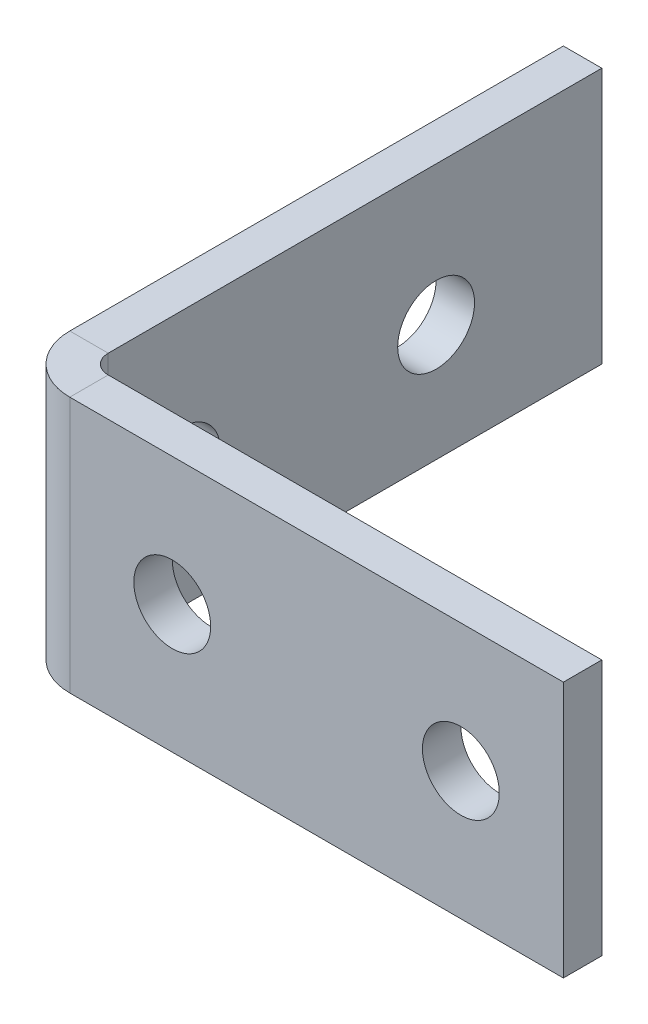
ISO-10303-21;
HEADER;
FILE_DESCRIPTION(('STEP AP214'),'2;1');
FILE_NAME('part.step','',(''),(''),'','','');
FILE_SCHEMA(('AUTOMOTIVE_DESIGN { 1 0 10303 214 1 1 1 1 }'));
ENDSEC;
DATA;
#1=APPLICATION_CONTEXT('core data for automotive mechanical design processes');
#2=APPLICATION_PROTOCOL_DEFINITION('international standard','automotive_design',2000,#1);
#3=PRODUCT_CONTEXT('',#1,'mechanical');
#4=PRODUCT('Part','Part','',(#3));
#5=PRODUCT_RELATED_PRODUCT_CATEGORY('part','',(#4));
#6=PRODUCT_DEFINITION_FORMATION('','',#4);
#7=PRODUCT_DEFINITION_CONTEXT('part definition',#1,'design');
#8=PRODUCT_DEFINITION('design','',#6,#7);
#9=PRODUCT_DEFINITION_SHAPE('','',#8);
#10=(LENGTH_UNIT() NAMED_UNIT(*) SI_UNIT(.MILLI.,.METRE.));
#11=(NAMED_UNIT(*) PLANE_ANGLE_UNIT() SI_UNIT($,.RADIAN.));
#12=(NAMED_UNIT(*) SI_UNIT($,.STERADIAN.) SOLID_ANGLE_UNIT());
#13=UNCERTAINTY_MEASURE_WITH_UNIT(LENGTH_MEASURE(1.E-05),#10,'distance_accuracy_value','');
#14=(GEOMETRIC_REPRESENTATION_CONTEXT(3) GLOBAL_UNCERTAINTY_ASSIGNED_CONTEXT((#13)) GLOBAL_UNIT_ASSIGNED_CONTEXT((#10,
#11,#12)) REPRESENTATION_CONTEXT('',''));
#15=CARTESIAN_POINT('',(0.,0.,0.));
#16=DIRECTION('',(0.,0.,1.));
#17=DIRECTION('',(1.,0.,0.));
#18=AXIS2_PLACEMENT_3D('',#15,#16,#17);
#19=CARTESIAN_POINT('',(-1.5,10.,0.));
#20=DIRECTION('',(1.,0.,0.));
#21=DIRECTION('',(0.,0.,-1.));
#22=AXIS2_PLACEMENT_3D('',#19,#20,#21);
#23=PLANE('',#22);
#24=CARTESIAN_POINT('',(-1.5,4.56076284628182,16.3870233657253));
#25=DIRECTION('',(-1.,0.,0.));
#26=DIRECTION('',(0.,0.,1.));
#27=AXIS2_PLACEMENT_3D('',#24,#25,#26);
#28=CIRCLE('',#27,1.49999999999999);
#29=CARTESIAN_POINT('',(-1.5,4.56076284628182,17.8870233657253));
#30=VERTEX_POINT('',#29);
#31=EDGE_CURVE('E258',#30,#30,#28,.T.);
#32=ORIENTED_EDGE('',*,*,#31,.F.);
#33=EDGE_LOOP('',(#32));
#34=FACE_BOUND('',#33,.T.);
#35=DIRECTION('',(0.,0.,1.));
#36=VECTOR('',#35,1.);
#37=CARTESIAN_POINT('',(-1.5,0.,0.));
#38=LINE('',#37,#36);
#39=CARTESIAN_POINT('',(-1.5,0.,0.));
#40=VERTEX_POINT('',#39);
#41=CARTESIAN_POINT('',(-1.5,0.,19.2634));
#42=VERTEX_POINT('',#41);
#43=EDGE_CURVE('E155',#40,#42,#38,.T.);
#44=ORIENTED_EDGE('',*,*,#43,.T.);
#45=DIRECTION('',(0.,-1.,0.));
#46=VECTOR('',#45,1.);
#47=CARTESIAN_POINT('',(-1.5,10.,19.2634));
#48=LINE('',#47,#46);
#49=CARTESIAN_POINT('',(-1.5,10.,19.2634));
#50=VERTEX_POINT('',#49);
#51=EDGE_CURVE('E118',#50,#42,#48,.T.);
#52=ORIENTED_EDGE('',*,*,#51,.F.);
#53=DIRECTION('',(0.,0.,1.));
#54=VECTOR('',#53,1.);
#55=CARTESIAN_POINT('',(-1.5,10.,0.));
#56=LINE('',#55,#54);
#57=CARTESIAN_POINT('',(-1.5,10.,0.));
#58=VERTEX_POINT('',#57);
#59=EDGE_CURVE('E122',#58,#50,#56,.T.);
#60=ORIENTED_EDGE('',*,*,#59,.F.);
#61=DIRECTION('',(0.,-1.,0.));
#62=VECTOR('',#61,1.);
#63=CARTESIAN_POINT('',(-1.5,10.,0.));
#64=LINE('',#63,#62);
#65=EDGE_CURVE('E109',#58,#40,#64,.T.);
#66=ORIENTED_EDGE('',*,*,#65,.T.);
#67=EDGE_LOOP('',(#44,#52,#60,#66));
#68=FACE_BOUND('',#67,.T.);
#69=CARTESIAN_POINT('',(-1.5,4.56076284628182,6.46670351632039));
#70=DIRECTION('',(-1.,0.,0.));
#71=DIRECTION('',(0.,0.,1.));
#72=AXIS2_PLACEMENT_3D('',#69,#70,#71);
#73=CIRCLE('',#72,1.49999999999999);
#74=CARTESIAN_POINT('',(-1.5,4.56076284628182,7.96670351632038));
#75=VERTEX_POINT('',#74);
#76=EDGE_CURVE('E252',#75,#75,#73,.T.);
#77=ORIENTED_EDGE('',*,*,#76,.F.);
#78=EDGE_LOOP('',(#77));
#79=FACE_BOUND('',#78,.T.);
#80=ADVANCED_FACE('F36',(#34,#68,#79),#23,.F.);
#81=CARTESIAN_POINT('',(0.736600000000002,10.,20.));
#82=DIRECTION('',(0.,1.,0.));
#83=DIRECTION('',(0.,0.,1.));
#84=AXIS2_PLACEMENT_3D('',#81,#82,#83);
#85=PLANE('',#84);
#86=DIRECTION('',(0.,0.,1.));
#87=VECTOR('',#86,1.);
#88=CARTESIAN_POINT('',(0.736600000000002,10.,20.));
#89=LINE('',#88,#87);
#90=CARTESIAN_POINT('',(0.736600000000002,10.,20.));
#91=VERTEX_POINT('',#90);
#92=CARTESIAN_POINT('',(0.736600000000002,10.,21.5));
#93=VERTEX_POINT('',#92);
#94=EDGE_CURVE('E11',#91,#93,#89,.T.);
#95=ORIENTED_EDGE('',*,*,#94,.F.);
#96=CARTESIAN_POINT('',(0.736600000000002,10.,19.2634));
#97=DIRECTION('',(0.,-1.,0.));
#98=DIRECTION('',(0.,0.,-1.));
#99=AXIS2_PLACEMENT_3D('',#96,#97,#98);
#100=CIRCLE('',#99,0.7366);
#101=CARTESIAN_POINT('',(0.,10.,19.2634));
#102=VERTEX_POINT('',#101);
#103=EDGE_CURVE('E134',#102,#91,#100,.F.);
#104=ORIENTED_EDGE('',*,*,#103,.F.);
#105=DIRECTION('',(1.,0.,0.));
#106=VECTOR('',#105,1.);
#107=CARTESIAN_POINT('',(-1.5,10.,19.2634));
#108=LINE('',#107,#106);
#109=EDGE_CURVE('E45',#50,#102,#108,.T.);
#110=ORIENTED_EDGE('',*,*,#109,.F.);
#111=CARTESIAN_POINT('',(0.736600000000002,10.,19.2634));
#112=DIRECTION('',(0.,1.,0.));
#113=DIRECTION('',(1.,0.,0.));
#114=AXIS2_PLACEMENT_3D('',#111,#112,#113);
#115=CIRCLE('',#114,2.2366);
#116=EDGE_CURVE('E127',#50,#93,#115,.T.);
#117=ORIENTED_EDGE('',*,*,#116,.T.);
#118=EDGE_LOOP('',(#95,#104,#110,#117));
#119=FACE_BOUND('',#118,.T.);
#120=ADVANCED_FACE('F38',(#119),#85,.T.);
#121=CARTESIAN_POINT('',(-1.5,10.,19.2634));
#122=DIRECTION('',(0.,1.,0.));
#123=DIRECTION('',(0.,0.,1.));
#124=AXIS2_PLACEMENT_3D('',#121,#122,#123);
#125=PLANE('',#124);
#126=DIRECTION('',(1.,0.,0.));
#127=VECTOR('',#126,1.);
#128=CARTESIAN_POINT('',(0.,10.,20.));
#129=LINE('',#128,#127);
#130=CARTESIAN_POINT('',(20.,10.,20.));
#131=VERTEX_POINT('',#130);
#132=EDGE_CURVE('E184',#91,#131,#129,.T.);
#133=ORIENTED_EDGE('',*,*,#132,.F.);
#134=ORIENTED_EDGE('',*,*,#94,.T.);
#135=DIRECTION('',(1.,0.,0.));
#136=VECTOR('',#135,1.);
#137=CARTESIAN_POINT('',(0.,10.,21.5));
#138=LINE('',#137,#136);
#139=CARTESIAN_POINT('',(20.,10.,21.5));
#140=VERTEX_POINT('',#139);
#141=EDGE_CURVE('E93',#93,#140,#138,.T.);
#142=ORIENTED_EDGE('',*,*,#141,.T.);
#143=DIRECTION('',(0.,0.,1.));
#144=VECTOR('',#143,1.);
#145=CARTESIAN_POINT('',(20.,10.,20.));
#146=LINE('',#145,#144);
#147=EDGE_CURVE('E244',#131,#140,#146,.T.);
#148=ORIENTED_EDGE('',*,*,#147,.F.);
#149=EDGE_LOOP('',(#133,#134,#142,#148));
#150=FACE_BOUND('',#149,.T.);
#151=ADVANCED_FACE('F192',(#150),#125,.T.);
#152=CARTESIAN_POINT('',(0.,0.,19.2634));
#153=DIRECTION('',(0.,-1.,0.));
#154=DIRECTION('',(0.,0.,-1.));
#155=AXIS2_PLACEMENT_3D('',#152,#153,#154);
#156=PLANE('',#155);
#157=DIRECTION('',(-1.,0.,0.));
#158=VECTOR('',#157,1.);
#159=CARTESIAN_POINT('',(0.,0.,19.2634));
#160=LINE('',#159,#158);
#161=CARTESIAN_POINT('',(0.,0.,19.2634));
#162=VERTEX_POINT('',#161);
#163=EDGE_CURVE('E80',#162,#42,#160,.T.);
#164=ORIENTED_EDGE('',*,*,#163,.F.);
#165=CARTESIAN_POINT('',(0.736600000000002,0.,19.2634));
#166=DIRECTION('',(0.,-1.,0.));
#167=DIRECTION('',(0.,0.,-1.));
#168=AXIS2_PLACEMENT_3D('',#165,#166,#167);
#169=CIRCLE('',#168,0.7366);
#170=CARTESIAN_POINT('',(0.736600000000002,0.,20.));
#171=VERTEX_POINT('',#170);
#172=EDGE_CURVE('E150',#162,#171,#169,.F.);
#173=ORIENTED_EDGE('',*,*,#172,.T.);
#174=DIRECTION('',(0.,0.,-1.));
#175=VECTOR('',#174,1.);
#176=CARTESIAN_POINT('',(0.736600000000002,0.,21.5));
#177=LINE('',#176,#175);
#178=CARTESIAN_POINT('',(0.736600000000002,0.,21.5));
#179=VERTEX_POINT('',#178);
#180=EDGE_CURVE('E87',#179,#171,#177,.T.);
#181=ORIENTED_EDGE('',*,*,#180,.F.);
#182=CARTESIAN_POINT('',(0.736600000000002,0.,19.2634));
#183=DIRECTION('',(0.,1.,0.));
#184=DIRECTION('',(1.,0.,0.));
#185=AXIS2_PLACEMENT_3D('',#182,#183,#184);
#186=CIRCLE('',#185,2.2366);
#187=EDGE_CURVE('E157',#42,#179,#186,.T.);
#188=ORIENTED_EDGE('',*,*,#187,.F.);
#189=EDGE_LOOP('',(#164,#173,#181,#188));
#190=FACE_BOUND('',#189,.T.);
#191=ADVANCED_FACE('F190',(#190),#156,.T.);
#192=CARTESIAN_POINT('',(0.736600000000002,0.,21.5));
#193=DIRECTION('',(0.,-1.,0.));
#194=DIRECTION('',(0.,0.,-1.));
#195=AXIS2_PLACEMENT_3D('',#192,#193,#194);
#196=PLANE('',#195);
#197=DIRECTION('',(0.,0.,1.));
#198=VECTOR('',#197,1.);
#199=CARTESIAN_POINT('',(0.,0.,0.));
#200=LINE('',#199,#198);
#201=CARTESIAN_POINT('',(0.,0.,0.));
#202=VERTEX_POINT('',#201);
#203=EDGE_CURVE('E152',#202,#162,#200,.T.);
#204=ORIENTED_EDGE('',*,*,#203,.T.);
#205=ORIENTED_EDGE('',*,*,#163,.T.);
#206=ORIENTED_EDGE('',*,*,#43,.F.);
#207=DIRECTION('',(1.,0.,0.));
#208=VECTOR('',#207,1.);
#209=CARTESIAN_POINT('',(-1.5,0.,0.));
#210=LINE('',#209,#208);
#211=EDGE_CURVE('E115',#40,#202,#210,.T.);
#212=ORIENTED_EDGE('',*,*,#211,.T.);
#213=EDGE_LOOP('',(#204,#205,#206,#212));
#214=FACE_BOUND('',#213,.T.);
#215=ADVANCED_FACE('F186',(#214),#196,.T.);
#216=CARTESIAN_POINT('',(0.,10.,21.5));
#217=DIRECTION('',(0.,0.,-1.));
#218=DIRECTION('',(-1.,0.,0.));
#219=AXIS2_PLACEMENT_3D('',#216,#217,#218);
#220=PLANE('',#219);
#221=CARTESIAN_POINT('',(4.7366,5.,21.5));
#222=DIRECTION('',(0.,0.,-1.));
#223=DIRECTION('',(-1.,0.,0.));
#224=AXIS2_PLACEMENT_3D('',#221,#222,#223);
#225=CIRCLE('',#224,1.5);
#226=CARTESIAN_POINT('',(3.2366,5.,21.5));
#227=VERTEX_POINT('',#226);
#228=EDGE_CURVE('E233',#227,#227,#225,.T.);
#229=ORIENTED_EDGE('',*,*,#228,.T.);
#230=EDGE_LOOP('',(#229));
#231=FACE_BOUND('',#230,.T.);
#232=CARTESIAN_POINT('',(16.,5.,21.5));
#233=DIRECTION('',(0.,0.,-1.));
#234=DIRECTION('',(-1.,0.,0.));
#235=AXIS2_PLACEMENT_3D('',#232,#233,#234);
#236=CIRCLE('',#235,1.5);
#237=CARTESIAN_POINT('',(14.5,5.,21.5));
#238=VERTEX_POINT('',#237);
#239=EDGE_CURVE('E237',#238,#238,#236,.T.);
#240=ORIENTED_EDGE('',*,*,#239,.T.);
#241=EDGE_LOOP('',(#240));
#242=FACE_BOUND('',#241,.T.);
#243=DIRECTION('',(1.,0.,0.));
#244=VECTOR('',#243,1.);
#245=CARTESIAN_POINT('',(0.,0.,21.5));
#246=LINE('',#245,#244);
#247=CARTESIAN_POINT('',(20.,0.,21.5));
#248=VERTEX_POINT('',#247);
#249=EDGE_CURVE('E140',#179,#248,#246,.T.);
#250=ORIENTED_EDGE('',*,*,#249,.T.);
#251=DIRECTION('',(0.,-1.,0.));
#252=VECTOR('',#251,1.);
#253=CARTESIAN_POINT('',(20.,10.,21.5));
#254=LINE('',#253,#252);
#255=EDGE_CURVE('E171',#140,#248,#254,.T.);
#256=ORIENTED_EDGE('',*,*,#255,.F.);
#257=ORIENTED_EDGE('',*,*,#141,.F.);
#258=DIRECTION('',(0.,-1.,0.));
#259=VECTOR('',#258,1.);
#260=CARTESIAN_POINT('',(0.736600000000002,10.,21.5));
#261=LINE('',#260,#259);
#262=EDGE_CURVE('E139',#93,#179,#261,.T.);
#263=ORIENTED_EDGE('',*,*,#262,.T.);
#264=EDGE_LOOP('',(#250,#256,#257,#263));
#265=FACE_BOUND('',#264,.T.);
#266=ADVANCED_FACE('F198',(#231,#242,#265),#220,.F.);
#267=CARTESIAN_POINT('',(20.,10.,20.));
#268=DIRECTION('',(1.,0.,0.));
#269=DIRECTION('',(0.,0.,-1.));
#270=AXIS2_PLACEMENT_3D('',#267,#268,#269);
#271=PLANE('',#270);
#272=DIRECTION('',(0.,0.,1.));
#273=VECTOR('',#272,1.);
#274=CARTESIAN_POINT('',(20.,0.,20.));
#275=LINE('',#274,#273);
#276=CARTESIAN_POINT('',(20.,0.,20.));
#277=VERTEX_POINT('',#276);
#278=EDGE_CURVE('E143',#277,#248,#275,.T.);
#279=ORIENTED_EDGE('',*,*,#278,.F.);
#280=DIRECTION('',(0.,-1.,0.));
#281=VECTOR('',#280,1.);
#282=CARTESIAN_POINT('',(20.,10.,20.));
#283=LINE('',#282,#281);
#284=EDGE_CURVE('E169',#131,#277,#283,.T.);
#285=ORIENTED_EDGE('',*,*,#284,.F.);
#286=ORIENTED_EDGE('',*,*,#147,.T.);
#287=ORIENTED_EDGE('',*,*,#255,.T.);
#288=EDGE_LOOP('',(#279,#285,#286,#287));
#289=FACE_BOUND('',#288,.T.);
#290=ADVANCED_FACE('F220',(#289),#271,.T.);
#291=CARTESIAN_POINT('',(0.,10.,20.));
#292=DIRECTION('',(0.,0.,-1.));
#293=DIRECTION('',(-1.,0.,0.));
#294=AXIS2_PLACEMENT_3D('',#291,#292,#293);
#295=PLANE('',#294);
#296=CARTESIAN_POINT('',(4.7366,5.,20.));
#297=DIRECTION('',(0.,0.,-1.));
#298=DIRECTION('',(-1.,0.,0.));
#299=AXIS2_PLACEMENT_3D('',#296,#297,#298);
#300=CIRCLE('',#299,1.49999999999999);
#301=CARTESIAN_POINT('',(3.23660000000001,5.,20.));
#302=VERTEX_POINT('',#301);
#303=EDGE_CURVE('E266',#302,#302,#300,.T.);
#304=ORIENTED_EDGE('',*,*,#303,.F.);
#305=EDGE_LOOP('',(#304));
#306=FACE_BOUND('',#305,.T.);
#307=CARTESIAN_POINT('',(16.,5.,20.));
#308=DIRECTION('',(0.,0.,-1.));
#309=DIRECTION('',(-1.,0.,0.));
#310=AXIS2_PLACEMENT_3D('',#307,#308,#309);
#311=CIRCLE('',#310,1.49999999999999);
#312=CARTESIAN_POINT('',(14.5,5.,20.));
#313=VERTEX_POINT('',#312);
#314=EDGE_CURVE('E262',#313,#313,#311,.T.);
#315=ORIENTED_EDGE('',*,*,#314,.F.);
#316=EDGE_LOOP('',(#315));
#317=FACE_BOUND('',#316,.T.);
#318=DIRECTION('',(1.,0.,0.));
#319=VECTOR('',#318,1.);
#320=CARTESIAN_POINT('',(0.,0.,20.));
#321=LINE('',#320,#319);
#322=EDGE_CURVE('E147',#171,#277,#321,.T.);
#323=ORIENTED_EDGE('',*,*,#322,.F.);
#324=DIRECTION('',(0.,-1.,0.));
#325=VECTOR('',#324,1.);
#326=CARTESIAN_POINT('',(0.736600000000002,10.,20.));
#327=LINE('',#326,#325);
#328=EDGE_CURVE('E166',#91,#171,#327,.T.);
#329=ORIENTED_EDGE('',*,*,#328,.F.);
#330=ORIENTED_EDGE('',*,*,#132,.T.);
#331=ORIENTED_EDGE('',*,*,#284,.T.);
#332=EDGE_LOOP('',(#323,#329,#330,#331));
#333=FACE_BOUND('',#332,.T.);
#334=ADVANCED_FACE('F217',(#306,#317,#333),#295,.T.);
#335=CARTESIAN_POINT('',(0.736600000000002,10.,19.2634));
#336=DIRECTION('',(0.,-1.,0.));
#337=DIRECTION('',(0.,0.,-1.));
#338=AXIS2_PLACEMENT_3D('',#335,#336,#337);
#339=CYLINDRICAL_SURFACE('',#338,0.7366);
#340=ORIENTED_EDGE('',*,*,#172,.F.);
#341=DIRECTION('',(0.,-1.,0.));
#342=VECTOR('',#341,1.);
#343=CARTESIAN_POINT('',(0.,10.,19.2634));
#344=LINE('',#343,#342);
#345=EDGE_CURVE('E163',#102,#162,#344,.T.);
#346=ORIENTED_EDGE('',*,*,#345,.F.);
#347=ORIENTED_EDGE('',*,*,#103,.T.);
#348=ORIENTED_EDGE('',*,*,#328,.T.);
#349=EDGE_LOOP('',(#340,#346,#347,#348));
#350=FACE_BOUND('',#349,.T.);
#351=ADVANCED_FACE('F180',(#350),#339,.F.);
#352=CARTESIAN_POINT('',(0.,10.,0.));
#353=DIRECTION('',(1.,0.,0.));
#354=DIRECTION('',(0.,0.,-1.));
#355=AXIS2_PLACEMENT_3D('',#352,#353,#354);
#356=PLANE('',#355);
#357=CARTESIAN_POINT('',(0.,4.56076284628182,16.3870233657253));
#358=DIRECTION('',(1.,0.,0.));
#359=DIRECTION('',(0.,0.,-1.));
#360=AXIS2_PLACEMENT_3D('',#357,#358,#359);
#361=CIRCLE('',#360,1.49999999999999);
#362=CARTESIAN_POINT('',(0.,4.56076284628182,14.8870233657253));
#363=VERTEX_POINT('',#362);
#364=EDGE_CURVE('E255',#363,#363,#361,.T.);
#365=ORIENTED_EDGE('',*,*,#364,.F.);
#366=EDGE_LOOP('',(#365));
#367=FACE_BOUND('',#366,.T.);
#368=CARTESIAN_POINT('',(0.,4.56076284628182,6.46670351632039));
#369=DIRECTION('',(1.,0.,0.));
#370=DIRECTION('',(0.,0.,-1.));
#371=AXIS2_PLACEMENT_3D('',#368,#369,#370);
#372=CIRCLE('',#371,1.49999999999999);
#373=CARTESIAN_POINT('',(0.,4.56076284628182,4.9667035163204));
#374=VERTEX_POINT('',#373);
#375=EDGE_CURVE('E144',#374,#374,#372,.T.);
#376=ORIENTED_EDGE('',*,*,#375,.F.);
#377=EDGE_LOOP('',(#376));
#378=FACE_BOUND('',#377,.T.);
#379=ORIENTED_EDGE('',*,*,#203,.F.);
#380=DIRECTION('',(0.,-1.,0.));
#381=VECTOR('',#380,1.);
#382=CARTESIAN_POINT('',(0.,10.,0.));
#383=LINE('',#382,#381);
#384=CARTESIAN_POINT('',(0.,10.,0.));
#385=VERTEX_POINT('',#384);
#386=EDGE_CURVE('E117',#385,#202,#383,.T.);
#387=ORIENTED_EDGE('',*,*,#386,.F.);
#388=DIRECTION('',(0.,0.,1.));
#389=VECTOR('',#388,1.);
#390=CARTESIAN_POINT('',(0.,10.,0.));
#391=LINE('',#390,#389);
#392=EDGE_CURVE('E132',#385,#102,#391,.T.);
#393=ORIENTED_EDGE('',*,*,#392,.T.);
#394=ORIENTED_EDGE('',*,*,#345,.T.);
#395=EDGE_LOOP('',(#379,#387,#393,#394));
#396=FACE_BOUND('',#395,.T.);
#397=ADVANCED_FACE('F185',(#367,#378,#396),#356,.T.);
#398=CARTESIAN_POINT('',(-1.5,10.,0.));
#399=DIRECTION('',(0.,0.,-1.));
#400=DIRECTION('',(-1.,0.,0.));
#401=AXIS2_PLACEMENT_3D('',#398,#399,#400);
#402=PLANE('',#401);
#403=ORIENTED_EDGE('',*,*,#211,.F.);
#404=ORIENTED_EDGE('',*,*,#65,.F.);
#405=DIRECTION('',(1.,0.,0.));
#406=VECTOR('',#405,1.);
#407=CARTESIAN_POINT('',(-1.5,10.,0.));
#408=LINE('',#407,#406);
#409=EDGE_CURVE('E113',#58,#385,#408,.T.);
#410=ORIENTED_EDGE('',*,*,#409,.T.);
#411=ORIENTED_EDGE('',*,*,#386,.T.);
#412=EDGE_LOOP('',(#403,#404,#410,#411));
#413=FACE_BOUND('',#412,.T.);
#414=ADVANCED_FACE('F111',(#413),#402,.T.);
#415=CARTESIAN_POINT('',(0.736600000000002,10.,19.2634));
#416=DIRECTION('',(0.,-1.,0.));
#417=DIRECTION('',(0.,0.,-1.));
#418=AXIS2_PLACEMENT_3D('',#415,#416,#417);
#419=CYLINDRICAL_SURFACE('',#418,2.2366);
#420=ORIENTED_EDGE('',*,*,#187,.T.);
#421=ORIENTED_EDGE('',*,*,#262,.F.);
#422=ORIENTED_EDGE('',*,*,#116,.F.);
#423=ORIENTED_EDGE('',*,*,#51,.T.);
#424=EDGE_LOOP('',(#420,#421,#422,#423));
#425=FACE_BOUND('',#424,.T.);
#426=ADVANCED_FACE('F188',(#425),#419,.T.);
#427=CARTESIAN_POINT('',(0.736600000000002,10.,19.2634));
#428=DIRECTION('',(0.,-1.,0.));
#429=DIRECTION('',(-1.,0.,0.));
#430=AXIS2_PLACEMENT_3D('',#427,#428,#429);
#431=PLANE('',#430);
#432=ORIENTED_EDGE('',*,*,#59,.T.);
#433=ORIENTED_EDGE('',*,*,#109,.T.);
#434=ORIENTED_EDGE('',*,*,#392,.F.);
#435=ORIENTED_EDGE('',*,*,#409,.F.);
#436=EDGE_LOOP('',(#432,#433,#434,#435));
#437=FACE_BOUND('',#436,.T.);
#438=ADVANCED_FACE('F130',(#437),#431,.F.);
#439=CARTESIAN_POINT('',(0.736600000000002,0.,19.2634));
#440=DIRECTION('',(0.,-1.,0.));
#441=DIRECTION('',(-1.,0.,0.));
#442=AXIS2_PLACEMENT_3D('',#439,#440,#441);
#443=PLANE('',#442);
#444=ORIENTED_EDGE('',*,*,#249,.F.);
#445=ORIENTED_EDGE('',*,*,#180,.T.);
#446=ORIENTED_EDGE('',*,*,#322,.T.);
#447=ORIENTED_EDGE('',*,*,#278,.T.);
#448=EDGE_LOOP('',(#444,#445,#446,#447));
#449=FACE_BOUND('',#448,.T.);
#450=ADVANCED_FACE('F242',(#449),#443,.T.);
#451=CARTESIAN_POINT('',(-1.5,4.56076284628182,6.46670351632039));
#452=DIRECTION('',(-1.,0.,0.));
#453=DIRECTION('',(0.,0.,1.));
#454=AXIS2_PLACEMENT_3D('',#451,#452,#453);
#455=CYLINDRICAL_SURFACE('',#454,1.49999999999999);
#456=ORIENTED_EDGE('',*,*,#76,.T.);
#457=EDGE_LOOP('',(#456));
#458=FACE_BOUND('',#457,.T.);
#459=ORIENTED_EDGE('',*,*,#375,.T.);
#460=EDGE_LOOP('',(#459));
#461=FACE_BOUND('',#460,.T.);
#462=ADVANCED_FACE('F286',(#458,#461),#455,.F.);
#463=CARTESIAN_POINT('',(-1.5,4.56076284628182,16.3870233657253));
#464=DIRECTION('',(-1.,0.,0.));
#465=DIRECTION('',(0.,0.,1.));
#466=AXIS2_PLACEMENT_3D('',#463,#464,#465);
#467=CYLINDRICAL_SURFACE('',#466,1.49999999999999);
#468=ORIENTED_EDGE('',*,*,#31,.T.);
#469=EDGE_LOOP('',(#468));
#470=FACE_BOUND('',#469,.T.);
#471=ORIENTED_EDGE('',*,*,#364,.T.);
#472=EDGE_LOOP('',(#471));
#473=FACE_BOUND('',#472,.T.);
#474=ADVANCED_FACE('F277',(#470,#473),#467,.F.);
#475=CARTESIAN_POINT('',(16.,5.,20.));
#476=DIRECTION('',(0.,0.,-1.));
#477=DIRECTION('',(-1.,0.,0.));
#478=AXIS2_PLACEMENT_3D('',#475,#476,#477);
#479=CYLINDRICAL_SURFACE('',#478,1.49999999999999);
#480=ORIENTED_EDGE('',*,*,#239,.F.);
#481=EDGE_LOOP('',(#480));
#482=FACE_BOUND('',#481,.T.);
#483=ORIENTED_EDGE('',*,*,#314,.T.);
#484=EDGE_LOOP('',(#483));
#485=FACE_BOUND('',#484,.T.);
#486=ADVANCED_FACE('F275',(#482,#485),#479,.F.);
#487=CARTESIAN_POINT('',(4.7366,5.,20.));
#488=DIRECTION('',(0.,0.,-1.));
#489=DIRECTION('',(-1.,0.,0.));
#490=AXIS2_PLACEMENT_3D('',#487,#488,#489);
#491=CYLINDRICAL_SURFACE('',#490,1.49999999999999);
#492=ORIENTED_EDGE('',*,*,#228,.F.);
#493=EDGE_LOOP('',(#492));
#494=FACE_BOUND('',#493,.T.);
#495=ORIENTED_EDGE('',*,*,#303,.T.);
#496=EDGE_LOOP('',(#495));
#497=FACE_BOUND('',#496,.T.);
#498=ADVANCED_FACE('F270',(#494,#497),#491,.F.);
#499=CLOSED_SHELL('',(#80,#120,#151,#191,#215,#266,#290,#334,#351,#397,#414,#426,#438,#450,#462,
#474,#486,#498));
#500=MANIFOLD_SOLID_BREP('B2',#499);
#501=ADVANCED_BREP_SHAPE_REPRESENTATION('',(#18,#500),#14);
#502=SHAPE_DEFINITION_REPRESENTATION(#9,#501);
ENDSEC;
END-ISO-10303-21;
